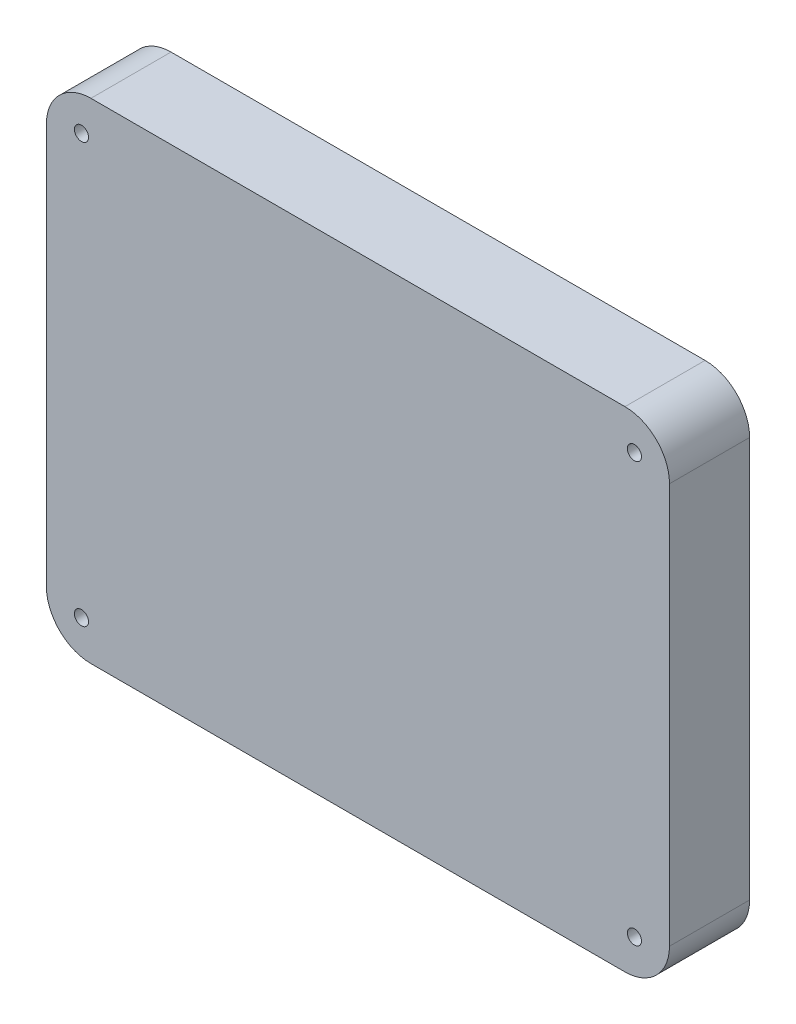
ISO-10303-21;
HEADER;
FILE_DESCRIPTION(('STEP AP214'),'2;1');
FILE_NAME('part.step','',(''),(''),'','','');
FILE_SCHEMA(('AUTOMOTIVE_DESIGN { 1 0 10303 214 1 1 1 1 }'));
ENDSEC;
DATA;
#1=APPLICATION_CONTEXT('core data for automotive mechanical design processes');
#2=APPLICATION_PROTOCOL_DEFINITION('international standard','automotive_design',2000,#1);
#3=PRODUCT_CONTEXT('',#1,'mechanical');
#4=PRODUCT('Part','Part','',(#3));
#5=PRODUCT_RELATED_PRODUCT_CATEGORY('part','',(#4));
#6=PRODUCT_DEFINITION_FORMATION('','',#4);
#7=PRODUCT_DEFINITION_CONTEXT('part definition',#1,'design');
#8=PRODUCT_DEFINITION('design','',#6,#7);
#9=PRODUCT_DEFINITION_SHAPE('','',#8);
#10=(LENGTH_UNIT() NAMED_UNIT(*) SI_UNIT(.MILLI.,.METRE.));
#11=(NAMED_UNIT(*) PLANE_ANGLE_UNIT() SI_UNIT($,.RADIAN.));
#12=(NAMED_UNIT(*) SI_UNIT($,.STERADIAN.) SOLID_ANGLE_UNIT());
#13=UNCERTAINTY_MEASURE_WITH_UNIT(LENGTH_MEASURE(1.E-05),#10,'distance_accuracy_value','');
#14=(GEOMETRIC_REPRESENTATION_CONTEXT(3) GLOBAL_UNCERTAINTY_ASSIGNED_CONTEXT((#13)) GLOBAL_UNIT_ASSIGNED_CONTEXT((#10,
#11,#12)) REPRESENTATION_CONTEXT('',''));
#15=CARTESIAN_POINT('',(0.,0.,0.));
#16=DIRECTION('',(0.,0.,1.));
#17=DIRECTION('',(1.,0.,0.));
#18=AXIS2_PLACEMENT_3D('',#15,#16,#17);
#19=CARTESIAN_POINT('',(109.99935,80.,18.));
#20=DIRECTION('',(0.,0.,-1.));
#21=DIRECTION('',(-1.,0.,0.));
#22=AXIS2_PLACEMENT_3D('',#19,#20,#21);
#23=CYLINDRICAL_SURFACE('',#22,9.99999999999999);
#24=CARTESIAN_POINT('',(109.99935,80.,0.));
#25=DIRECTION('',(0.,0.,1.));
#26=DIRECTION('',(1.,0.,0.));
#27=AXIS2_PLACEMENT_3D('',#24,#25,#26);
#28=CIRCLE('',#27,9.99999999999999);
#29=CARTESIAN_POINT('',(119.99935,80.,0.));
#30=VERTEX_POINT('',#29);
#31=CARTESIAN_POINT('',(109.99935,90.,0.));
#32=VERTEX_POINT('',#31);
#33=EDGE_CURVE('E137',#30,#32,#28,.T.);
#34=ORIENTED_EDGE('',*,*,#33,.T.);
#35=DIRECTION('',(0.,0.,-1.));
#36=VECTOR('',#35,1.);
#37=CARTESIAN_POINT('',(109.99935,90.,18.));
#38=LINE('',#37,#36);
#39=CARTESIAN_POINT('',(109.99935,90.,18.));
#40=VERTEX_POINT('',#39);
#41=EDGE_CURVE('E11',#40,#32,#38,.T.);
#42=ORIENTED_EDGE('',*,*,#41,.F.);
#43=CARTESIAN_POINT('',(109.99935,80.,18.));
#44=DIRECTION('',(0.,0.,1.));
#45=DIRECTION('',(1.,0.,0.));
#46=AXIS2_PLACEMENT_3D('',#43,#44,#45);
#47=CIRCLE('',#46,9.99999999999999);
#48=CARTESIAN_POINT('',(119.99935,80.,18.));
#49=VERTEX_POINT('',#48);
#50=EDGE_CURVE('E152',#49,#40,#47,.T.);
#51=ORIENTED_EDGE('',*,*,#50,.F.);
#52=DIRECTION('',(0.,0.,-1.));
#53=VECTOR('',#52,1.);
#54=CARTESIAN_POINT('',(119.99935,80.,18.));
#55=LINE('',#54,#53);
#56=EDGE_CURVE('E133',#49,#30,#55,.T.);
#57=ORIENTED_EDGE('',*,*,#56,.T.);
#58=EDGE_LOOP('',(#34,#42,#51,#57));
#59=FACE_BOUND('',#58,.T.);
#60=ADVANCED_FACE('F39',(#59),#23,.T.);
#61=CARTESIAN_POINT('',(109.99935,90.,18.));
#62=DIRECTION('',(0.,-1.,0.));
#63=DIRECTION('',(1.,0.,0.));
#64=AXIS2_PLACEMENT_3D('',#61,#62,#63);
#65=PLANE('',#64);
#66=DIRECTION('',(-1.,0.,0.));
#67=VECTOR('',#66,1.);
#68=CARTESIAN_POINT('',(109.99935,90.,0.));
#69=LINE('',#68,#67);
#70=CARTESIAN_POINT('',(-10.00065,90.,0.));
#71=VERTEX_POINT('',#70);
#72=EDGE_CURVE('E140',#32,#71,#69,.T.);
#73=ORIENTED_EDGE('',*,*,#72,.T.);
#74=DIRECTION('',(0.,0.,-1.));
#75=VECTOR('',#74,1.);
#76=CARTESIAN_POINT('',(-10.00065,90.,18.));
#77=LINE('',#76,#75);
#78=CARTESIAN_POINT('',(-10.00065,90.,18.));
#79=VERTEX_POINT('',#78);
#80=EDGE_CURVE('E48',#79,#71,#77,.T.);
#81=ORIENTED_EDGE('',*,*,#80,.F.);
#82=DIRECTION('',(-1.,0.,0.));
#83=VECTOR('',#82,1.);
#84=CARTESIAN_POINT('',(109.99935,90.,18.));
#85=LINE('',#84,#83);
#86=EDGE_CURVE('E100',#40,#79,#85,.T.);
#87=ORIENTED_EDGE('',*,*,#86,.F.);
#88=ORIENTED_EDGE('',*,*,#41,.T.);
#89=EDGE_LOOP('',(#73,#81,#87,#88));
#90=FACE_BOUND('',#89,.T.);
#91=ADVANCED_FACE('F193',(#90),#65,.F.);
#92=CARTESIAN_POINT('',(-10.00065,80.,18.));
#93=DIRECTION('',(0.,0.,-1.));
#94=DIRECTION('',(-1.,0.,0.));
#95=AXIS2_PLACEMENT_3D('',#92,#93,#94);
#96=CYLINDRICAL_SURFACE('',#95,9.99999999999999);
#97=CARTESIAN_POINT('',(-10.00065,80.,0.));
#98=DIRECTION('',(0.,0.,1.));
#99=DIRECTION('',(1.,0.,0.));
#100=AXIS2_PLACEMENT_3D('',#97,#98,#99);
#101=CIRCLE('',#100,9.99999999999999);
#102=CARTESIAN_POINT('',(-20.00065,80.,0.));
#103=VERTEX_POINT('',#102);
#104=EDGE_CURVE('E142',#71,#103,#101,.T.);
#105=ORIENTED_EDGE('',*,*,#104,.T.);
#106=DIRECTION('',(0.,0.,-1.));
#107=VECTOR('',#106,1.);
#108=CARTESIAN_POINT('',(-20.00065,80.,18.));
#109=LINE('',#108,#107);
#110=CARTESIAN_POINT('',(-20.00065,80.,18.));
#111=VERTEX_POINT('',#110);
#112=EDGE_CURVE('E159',#111,#103,#109,.T.);
#113=ORIENTED_EDGE('',*,*,#112,.F.);
#114=CARTESIAN_POINT('',(-10.00065,80.,18.));
#115=DIRECTION('',(0.,0.,1.));
#116=DIRECTION('',(1.,0.,0.));
#117=AXIS2_PLACEMENT_3D('',#114,#115,#116);
#118=CIRCLE('',#117,9.99999999999999);
#119=EDGE_CURVE('E208',#79,#111,#118,.T.);
#120=ORIENTED_EDGE('',*,*,#119,.F.);
#121=ORIENTED_EDGE('',*,*,#80,.T.);
#122=EDGE_LOOP('',(#105,#113,#120,#121));
#123=FACE_BOUND('',#122,.T.);
#124=ADVANCED_FACE('F198',(#123),#96,.T.);
#125=CARTESIAN_POINT('',(-20.00065,80.,18.));
#126=DIRECTION('',(1.,0.,0.));
#127=DIRECTION('',(0.,1.,0.));
#128=AXIS2_PLACEMENT_3D('',#125,#126,#127);
#129=PLANE('',#128);
#130=DIRECTION('',(0.,-1.,0.));
#131=VECTOR('',#130,1.);
#132=CARTESIAN_POINT('',(-20.00065,80.,0.));
#133=LINE('',#132,#131);
#134=CARTESIAN_POINT('',(-20.00065,-9.99999999999999,0.));
#135=VERTEX_POINT('',#134);
#136=EDGE_CURVE('E144',#103,#135,#133,.T.);
#137=ORIENTED_EDGE('',*,*,#136,.T.);
#138=DIRECTION('',(0.,0.,-1.));
#139=VECTOR('',#138,1.);
#140=CARTESIAN_POINT('',(-20.00065,-9.99999999999999,18.));
#141=LINE('',#140,#139);
#142=CARTESIAN_POINT('',(-20.00065,-9.99999999999999,18.));
#143=VERTEX_POINT('',#142);
#144=EDGE_CURVE('E156',#143,#135,#141,.T.);
#145=ORIENTED_EDGE('',*,*,#144,.F.);
#146=DIRECTION('',(0.,-1.,0.));
#147=VECTOR('',#146,1.);
#148=CARTESIAN_POINT('',(-20.00065,80.,18.));
#149=LINE('',#148,#147);
#150=EDGE_CURVE('E210',#111,#143,#149,.T.);
#151=ORIENTED_EDGE('',*,*,#150,.F.);
#152=ORIENTED_EDGE('',*,*,#112,.T.);
#153=EDGE_LOOP('',(#137,#145,#151,#152));
#154=FACE_BOUND('',#153,.T.);
#155=ADVANCED_FACE('F256',(#154),#129,.F.);
#156=CARTESIAN_POINT('',(-10.00065,-9.99999999999999,18.));
#157=DIRECTION('',(0.,0.,-1.));
#158=DIRECTION('',(-1.,0.,0.));
#159=AXIS2_PLACEMENT_3D('',#156,#157,#158);
#160=CYLINDRICAL_SURFACE('',#159,10.);
#161=CARTESIAN_POINT('',(-10.00065,-9.99999999999999,0.));
#162=DIRECTION('',(0.,0.,1.));
#163=DIRECTION('',(1.,0.,0.));
#164=AXIS2_PLACEMENT_3D('',#161,#162,#163);
#165=CIRCLE('',#164,10.);
#166=CARTESIAN_POINT('',(-10.00065,-20.,0.));
#167=VERTEX_POINT('',#166);
#168=EDGE_CURVE('E146',#135,#167,#165,.T.);
#169=ORIENTED_EDGE('',*,*,#168,.T.);
#170=DIRECTION('',(0.,0.,-1.));
#171=VECTOR('',#170,1.);
#172=CARTESIAN_POINT('',(-10.00065,-20.,18.));
#173=LINE('',#172,#171);
#174=CARTESIAN_POINT('',(-10.00065,-20.,18.));
#175=VERTEX_POINT('',#174);
#176=EDGE_CURVE('E128',#175,#167,#173,.T.);
#177=ORIENTED_EDGE('',*,*,#176,.F.);
#178=CARTESIAN_POINT('',(-10.00065,-9.99999999999999,18.));
#179=DIRECTION('',(0.,0.,1.));
#180=DIRECTION('',(1.,0.,0.));
#181=AXIS2_PLACEMENT_3D('',#178,#179,#180);
#182=CIRCLE('',#181,10.);
#183=EDGE_CURVE('E119',#143,#175,#182,.T.);
#184=ORIENTED_EDGE('',*,*,#183,.F.);
#185=ORIENTED_EDGE('',*,*,#144,.T.);
#186=EDGE_LOOP('',(#169,#177,#184,#185));
#187=FACE_BOUND('',#186,.T.);
#188=ADVANCED_FACE('F253',(#187),#160,.T.);
#189=CARTESIAN_POINT('',(-10.00065,-20.,18.));
#190=DIRECTION('',(0.,1.,0.));
#191=DIRECTION('',(-1.,0.,0.));
#192=AXIS2_PLACEMENT_3D('',#189,#190,#191);
#193=PLANE('',#192);
#194=DIRECTION('',(1.,0.,0.));
#195=VECTOR('',#194,1.);
#196=CARTESIAN_POINT('',(-10.00065,-20.,0.));
#197=LINE('',#196,#195);
#198=CARTESIAN_POINT('',(109.99935,-20.,0.));
#199=VERTEX_POINT('',#198);
#200=EDGE_CURVE('E127',#167,#199,#197,.T.);
#201=ORIENTED_EDGE('',*,*,#200,.T.);
#202=DIRECTION('',(0.,0.,-1.));
#203=VECTOR('',#202,1.);
#204=CARTESIAN_POINT('',(109.99935,-20.,18.));
#205=LINE('',#204,#203);
#206=CARTESIAN_POINT('',(109.99935,-20.,18.));
#207=VERTEX_POINT('',#206);
#208=EDGE_CURVE('E124',#207,#199,#205,.T.);
#209=ORIENTED_EDGE('',*,*,#208,.F.);
#210=DIRECTION('',(1.,0.,0.));
#211=VECTOR('',#210,1.);
#212=CARTESIAN_POINT('',(-10.00065,-20.,18.));
#213=LINE('',#212,#211);
#214=EDGE_CURVE('E113',#175,#207,#213,.T.);
#215=ORIENTED_EDGE('',*,*,#214,.F.);
#216=ORIENTED_EDGE('',*,*,#176,.T.);
#217=EDGE_LOOP('',(#201,#209,#215,#216));
#218=FACE_BOUND('',#217,.T.);
#219=ADVANCED_FACE('F125',(#218),#193,.F.);
#220=CARTESIAN_POINT('',(109.99935,-10.,18.));
#221=DIRECTION('',(0.,0.,-1.));
#222=DIRECTION('',(-1.,0.,0.));
#223=AXIS2_PLACEMENT_3D('',#220,#221,#222);
#224=CYLINDRICAL_SURFACE('',#223,10.);
#225=CARTESIAN_POINT('',(109.99935,-10.,0.));
#226=DIRECTION('',(0.,0.,1.));
#227=DIRECTION('',(1.,0.,0.));
#228=AXIS2_PLACEMENT_3D('',#225,#226,#227);
#229=CIRCLE('',#228,10.);
#230=CARTESIAN_POINT('',(119.99935,-10.,0.));
#231=VERTEX_POINT('',#230);
#232=EDGE_CURVE('E86',#199,#231,#229,.T.);
#233=ORIENTED_EDGE('',*,*,#232,.T.);
#234=DIRECTION('',(0.,0.,-1.));
#235=VECTOR('',#234,1.);
#236=CARTESIAN_POINT('',(119.99935,-10.,18.));
#237=LINE('',#236,#235);
#238=CARTESIAN_POINT('',(119.99935,-10.,18.));
#239=VERTEX_POINT('',#238);
#240=EDGE_CURVE('E129',#239,#231,#237,.T.);
#241=ORIENTED_EDGE('',*,*,#240,.F.);
#242=CARTESIAN_POINT('',(109.99935,-10.,18.));
#243=DIRECTION('',(0.,0.,1.));
#244=DIRECTION('',(1.,0.,0.));
#245=AXIS2_PLACEMENT_3D('',#242,#243,#244);
#246=CIRCLE('',#245,10.);
#247=EDGE_CURVE('E117',#207,#239,#246,.T.);
#248=ORIENTED_EDGE('',*,*,#247,.F.);
#249=ORIENTED_EDGE('',*,*,#208,.T.);
#250=EDGE_LOOP('',(#233,#241,#248,#249));
#251=FACE_BOUND('',#250,.T.);
#252=ADVANCED_FACE('F131',(#251),#224,.T.);
#253=CARTESIAN_POINT('',(119.99935,-10.,18.));
#254=DIRECTION('',(-1.,0.,0.));
#255=DIRECTION('',(0.,0.,1.));
#256=AXIS2_PLACEMENT_3D('',#253,#254,#255);
#257=PLANE('',#256);
#258=DIRECTION('',(0.,1.,0.));
#259=VECTOR('',#258,1.);
#260=CARTESIAN_POINT('',(119.99935,-10.,0.));
#261=LINE('',#260,#259);
#262=EDGE_CURVE('E92',#231,#30,#261,.T.);
#263=ORIENTED_EDGE('',*,*,#262,.T.);
#264=ORIENTED_EDGE('',*,*,#56,.F.);
#265=DIRECTION('',(0.,1.,0.));
#266=VECTOR('',#265,1.);
#267=CARTESIAN_POINT('',(119.99935,-10.,18.));
#268=LINE('',#267,#266);
#269=EDGE_CURVE('E57',#239,#49,#268,.T.);
#270=ORIENTED_EDGE('',*,*,#269,.F.);
#271=ORIENTED_EDGE('',*,*,#240,.T.);
#272=EDGE_LOOP('',(#263,#264,#270,#271));
#273=FACE_BOUND('',#272,.T.);
#274=ADVANCED_FACE('F231',(#273),#257,.F.);
#275=CARTESIAN_POINT('',(109.99935,80.,18.));
#276=DIRECTION('',(0.,0.,1.));
#277=DIRECTION('',(1.,0.,0.));
#278=AXIS2_PLACEMENT_3D('',#275,#276,#277);
#279=PLANE('',#278);
#280=CARTESIAN_POINT('',(-12.1219703435596,-12.1213203435597,18.));
#281=DIRECTION('',(0.,0.,1.));
#282=DIRECTION('',(1.,0.,0.));
#283=AXIS2_PLACEMENT_3D('',#280,#281,#282);
#284=CIRCLE('',#283,1.5875);
#285=CARTESIAN_POINT('',(-10.5344703435596,-12.1213203435597,18.));
#286=VERTEX_POINT('',#285);
#287=EDGE_CURVE('E218',#286,#286,#284,.T.);
#288=ORIENTED_EDGE('',*,*,#287,.F.);
#289=EDGE_LOOP('',(#288));
#290=FACE_BOUND('',#289,.T.);
#291=CARTESIAN_POINT('',(112.12067034356,82.1213203435596,18.));
#292=DIRECTION('',(0.,0.,1.));
#293=DIRECTION('',(1.,0.,0.));
#294=AXIS2_PLACEMENT_3D('',#291,#292,#293);
#295=CIRCLE('',#294,1.5875);
#296=CARTESIAN_POINT('',(113.70817034356,82.1213203435596,18.));
#297=VERTEX_POINT('',#296);
#298=EDGE_CURVE('E219',#297,#297,#295,.T.);
#299=ORIENTED_EDGE('',*,*,#298,.F.);
#300=EDGE_LOOP('',(#299));
#301=FACE_BOUND('',#300,.T.);
#302=CARTESIAN_POINT('',(112.12067034356,-12.1213203435597,18.));
#303=DIRECTION('',(0.,0.,1.));
#304=DIRECTION('',(1.,0.,0.));
#305=AXIS2_PLACEMENT_3D('',#302,#303,#304);
#306=CIRCLE('',#305,1.5875);
#307=CARTESIAN_POINT('',(113.70817034356,-12.1213203435597,18.));
#308=VERTEX_POINT('',#307);
#309=EDGE_CURVE('E222',#308,#308,#306,.T.);
#310=ORIENTED_EDGE('',*,*,#309,.F.);
#311=EDGE_LOOP('',(#310));
#312=FACE_BOUND('',#311,.T.);
#313=CARTESIAN_POINT('',(-12.1219703435596,82.1213203435597,18.));
#314=DIRECTION('',(0.,0.,1.));
#315=DIRECTION('',(1.,0.,0.));
#316=AXIS2_PLACEMENT_3D('',#313,#314,#315);
#317=CIRCLE('',#316,1.5875);
#318=CARTESIAN_POINT('',(-10.5344703435596,82.1213203435597,18.));
#319=VERTEX_POINT('',#318);
#320=EDGE_CURVE('E168',#319,#319,#317,.T.);
#321=ORIENTED_EDGE('',*,*,#320,.F.);
#322=EDGE_LOOP('',(#321));
#323=FACE_BOUND('',#322,.T.);
#324=ORIENTED_EDGE('',*,*,#50,.T.);
#325=ORIENTED_EDGE('',*,*,#86,.T.);
#326=ORIENTED_EDGE('',*,*,#119,.T.);
#327=ORIENTED_EDGE('',*,*,#150,.T.);
#328=ORIENTED_EDGE('',*,*,#183,.T.);
#329=ORIENTED_EDGE('',*,*,#214,.T.);
#330=ORIENTED_EDGE('',*,*,#247,.T.);
#331=ORIENTED_EDGE('',*,*,#269,.T.);
#332=EDGE_LOOP('',(#324,#325,#326,#327,#328,#329,#330,#331));
#333=FACE_BOUND('',#332,.T.);
#334=ADVANCED_FACE('F115',(#290,#301,#312,#323,#333),#279,.T.);
#335=CARTESIAN_POINT('',(109.99935,80.,0.));
#336=DIRECTION('',(0.,0.,1.));
#337=DIRECTION('',(1.,0.,0.));
#338=AXIS2_PLACEMENT_3D('',#335,#336,#337);
#339=PLANE('',#338);
#340=CARTESIAN_POINT('',(-12.1219703435596,-12.1213203435597,0.));
#341=DIRECTION('',(0.,0.,1.));
#342=DIRECTION('',(1.,0.,0.));
#343=AXIS2_PLACEMENT_3D('',#340,#341,#342);
#344=CIRCLE('',#343,1.5875);
#345=CARTESIAN_POINT('',(-10.5344703435596,-12.1213203435597,0.));
#346=VERTEX_POINT('',#345);
#347=EDGE_CURVE('E42',#346,#346,#344,.T.);
#348=ORIENTED_EDGE('',*,*,#347,.T.);
#349=EDGE_LOOP('',(#348));
#350=FACE_BOUND('',#349,.T.);
#351=CARTESIAN_POINT('',(112.12067034356,82.1213203435596,0.));
#352=DIRECTION('',(0.,0.,1.));
#353=DIRECTION('',(1.,0.,0.));
#354=AXIS2_PLACEMENT_3D('',#351,#352,#353);
#355=CIRCLE('',#354,1.5875);
#356=CARTESIAN_POINT('',(113.70817034356,82.1213203435596,0.));
#357=VERTEX_POINT('',#356);
#358=EDGE_CURVE('E170',#357,#357,#355,.T.);
#359=ORIENTED_EDGE('',*,*,#358,.T.);
#360=EDGE_LOOP('',(#359));
#361=FACE_BOUND('',#360,.T.);
#362=CARTESIAN_POINT('',(112.12067034356,-12.1213203435597,0.));
#363=DIRECTION('',(0.,0.,1.));
#364=DIRECTION('',(1.,0.,0.));
#365=AXIS2_PLACEMENT_3D('',#362,#363,#364);
#366=CIRCLE('',#365,1.5875);
#367=CARTESIAN_POINT('',(113.70817034356,-12.1213203435597,0.));
#368=VERTEX_POINT('',#367);
#369=EDGE_CURVE('E167',#368,#368,#366,.T.);
#370=ORIENTED_EDGE('',*,*,#369,.T.);
#371=EDGE_LOOP('',(#370));
#372=FACE_BOUND('',#371,.T.);
#373=CARTESIAN_POINT('',(-12.1219703435596,82.1213203435597,0.));
#374=DIRECTION('',(0.,0.,1.));
#375=DIRECTION('',(1.,0.,0.));
#376=AXIS2_PLACEMENT_3D('',#373,#374,#375);
#377=CIRCLE('',#376,1.5875);
#378=CARTESIAN_POINT('',(-10.5344703435596,82.1213203435597,0.));
#379=VERTEX_POINT('',#378);
#380=EDGE_CURVE('E164',#379,#379,#377,.T.);
#381=ORIENTED_EDGE('',*,*,#380,.T.);
#382=EDGE_LOOP('',(#381));
#383=FACE_BOUND('',#382,.T.);
#384=ORIENTED_EDGE('',*,*,#33,.F.);
#385=ORIENTED_EDGE('',*,*,#262,.F.);
#386=ORIENTED_EDGE('',*,*,#232,.F.);
#387=ORIENTED_EDGE('',*,*,#200,.F.);
#388=ORIENTED_EDGE('',*,*,#168,.F.);
#389=ORIENTED_EDGE('',*,*,#136,.F.);
#390=ORIENTED_EDGE('',*,*,#104,.F.);
#391=ORIENTED_EDGE('',*,*,#72,.F.);
#392=EDGE_LOOP('',(#384,#385,#386,#387,#388,#389,#390,#391));
#393=FACE_BOUND('',#392,.T.);
#394=ADVANCED_FACE('F177',(#350,#361,#372,#383,#393),#339,.F.);
#395=CARTESIAN_POINT('',(-12.1219703435596,82.1213203435597,-12.));
#396=DIRECTION('',(0.,0.,1.));
#397=DIRECTION('',(1.,0.,0.));
#398=AXIS2_PLACEMENT_3D('',#395,#396,#397);
#399=CYLINDRICAL_SURFACE('',#398,1.5875);
#400=ORIENTED_EDGE('',*,*,#320,.T.);
#401=EDGE_LOOP('',(#400));
#402=FACE_BOUND('',#401,.T.);
#403=ORIENTED_EDGE('',*,*,#380,.F.);
#404=EDGE_LOOP('',(#403));
#405=FACE_BOUND('',#404,.T.);
#406=ADVANCED_FACE('F236',(#402,#405),#399,.F.);
#407=CARTESIAN_POINT('',(112.12067034356,-12.1213203435597,-12.));
#408=DIRECTION('',(0.,0.,1.));
#409=DIRECTION('',(1.,0.,0.));
#410=AXIS2_PLACEMENT_3D('',#407,#408,#409);
#411=CYLINDRICAL_SURFACE('',#410,1.5875);
#412=ORIENTED_EDGE('',*,*,#309,.T.);
#413=EDGE_LOOP('',(#412));
#414=FACE_BOUND('',#413,.T.);
#415=ORIENTED_EDGE('',*,*,#369,.F.);
#416=EDGE_LOOP('',(#415));
#417=FACE_BOUND('',#416,.T.);
#418=ADVANCED_FACE('F187',(#414,#417),#411,.F.);
#419=CARTESIAN_POINT('',(112.12067034356,82.1213203435596,-12.));
#420=DIRECTION('',(0.,0.,1.));
#421=DIRECTION('',(1.,0.,0.));
#422=AXIS2_PLACEMENT_3D('',#419,#420,#421);
#423=CYLINDRICAL_SURFACE('',#422,1.5875);
#424=ORIENTED_EDGE('',*,*,#298,.T.);
#425=EDGE_LOOP('',(#424));
#426=FACE_BOUND('',#425,.T.);
#427=ORIENTED_EDGE('',*,*,#358,.F.);
#428=EDGE_LOOP('',(#427));
#429=FACE_BOUND('',#428,.T.);
#430=ADVANCED_FACE('F181',(#426,#429),#423,.F.);
#431=CARTESIAN_POINT('',(-12.1219703435596,-12.1213203435597,-12.));
#432=DIRECTION('',(0.,0.,1.));
#433=DIRECTION('',(1.,0.,0.));
#434=AXIS2_PLACEMENT_3D('',#431,#432,#433);
#435=CYLINDRICAL_SURFACE('',#434,1.5875);
#436=ORIENTED_EDGE('',*,*,#287,.T.);
#437=EDGE_LOOP('',(#436));
#438=FACE_BOUND('',#437,.T.);
#439=ORIENTED_EDGE('',*,*,#347,.F.);
#440=EDGE_LOOP('',(#439));
#441=FACE_BOUND('',#440,.T.);
#442=ADVANCED_FACE('F179',(#438,#441),#435,.F.);
#443=CLOSED_SHELL('',(#60,#91,#124,#155,#188,#219,#252,#274,#334,#394,#406,#418,#430,#442));
#444=MANIFOLD_SOLID_BREP('B2',#443);
#445=ADVANCED_BREP_SHAPE_REPRESENTATION('',(#18,#444),#14);
#446=SHAPE_DEFINITION_REPRESENTATION(#9,#445);
ENDSEC;
END-ISO-10303-21;
